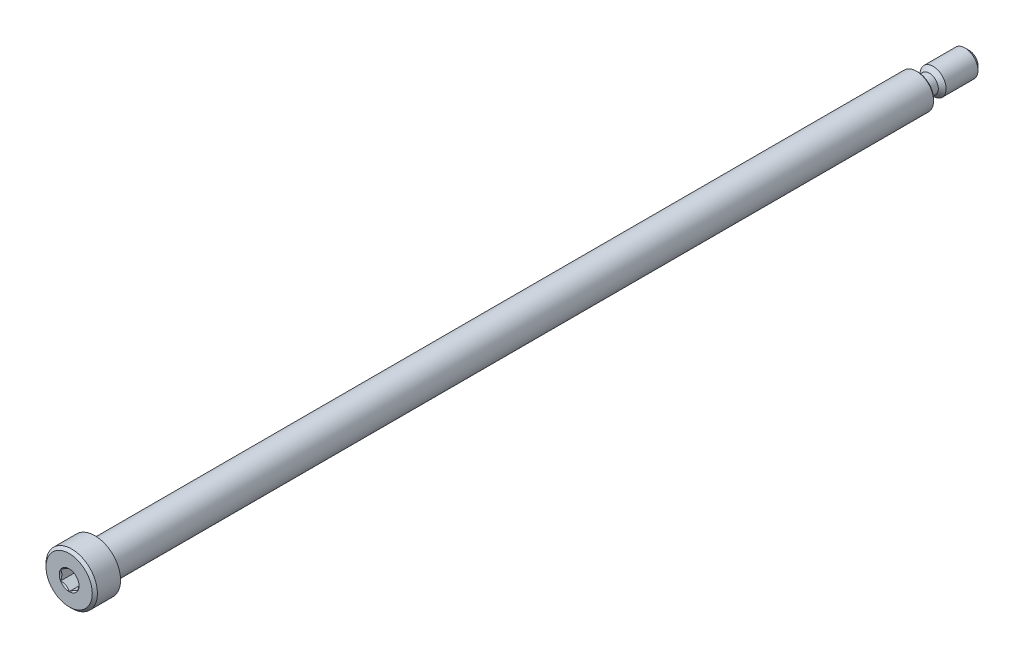
ISO-10303-21;
HEADER;
FILE_DESCRIPTION(('STEP AP214'),'2;1');
FILE_NAME('part.step','',(''),(''),'','','');
FILE_SCHEMA(('AUTOMOTIVE_DESIGN { 1 0 10303 214 1 1 1 1 }'));
ENDSEC;
DATA;
#1=APPLICATION_CONTEXT('core data for automotive mechanical design processes');
#2=APPLICATION_PROTOCOL_DEFINITION('international standard','automotive_design',2000,#1);
#3=PRODUCT_CONTEXT('',#1,'mechanical');
#4=PRODUCT('Part','Part','',(#3));
#5=PRODUCT_RELATED_PRODUCT_CATEGORY('part','',(#4));
#6=PRODUCT_DEFINITION_FORMATION('','',#4);
#7=PRODUCT_DEFINITION_CONTEXT('part definition',#1,'design');
#8=PRODUCT_DEFINITION('design','',#6,#7);
#9=PRODUCT_DEFINITION_SHAPE('','',#8);
#10=(LENGTH_UNIT() NAMED_UNIT(*) SI_UNIT(.MILLI.,.METRE.));
#11=(NAMED_UNIT(*) PLANE_ANGLE_UNIT() SI_UNIT($,.RADIAN.));
#12=(NAMED_UNIT(*) SI_UNIT($,.STERADIAN.) SOLID_ANGLE_UNIT());
#13=UNCERTAINTY_MEASURE_WITH_UNIT(LENGTH_MEASURE(1.E-05),#10,'distance_accuracy_value','');
#14=(GEOMETRIC_REPRESENTATION_CONTEXT(3) GLOBAL_UNCERTAINTY_ASSIGNED_CONTEXT((#13)) GLOBAL_UNIT_ASSIGNED_CONTEXT((#10,
#11,#12)) REPRESENTATION_CONTEXT('',''));
#15=CARTESIAN_POINT('',(0.,0.,0.));
#16=DIRECTION('',(0.,0.,1.));
#17=DIRECTION('',(1.,0.,0.));
#18=AXIS2_PLACEMENT_3D('',#15,#16,#17);
#19=CARTESIAN_POINT('',(0.,4.28625,83.34375));
#20=DIRECTION('',(0.,0.,-1.));
#21=DIRECTION('',(0.,1.,0.));
#22=AXIS2_PLACEMENT_3D('',#19,#20,#21);
#23=PLANE('',#22);
#24=CARTESIAN_POINT('',(0.,0.,83.34375));
#25=DIRECTION('',(0.,0.,1.));
#26=DIRECTION('',(1.,0.,0.));
#27=AXIS2_PLACEMENT_3D('',#24,#25,#26);
#28=CIRCLE('',#27,1.83308710467706);
#29=CARTESIAN_POINT('',(0.,1.83308710467706,83.34375));
#30=VERTEX_POINT('',#29);
#31=CARTESIAN_POINT('',(-1.5875,0.916543552338533,83.34375));
#32=VERTEX_POINT('',#31);
#33=EDGE_CURVE('E139',#30,#32,#28,.T.);
#34=ORIENTED_EDGE('',*,*,#33,.F.);
#35=CARTESIAN_POINT('',(1.5875,0.916543552338532,83.34375));
#36=VERTEX_POINT('',#35);
#37=EDGE_CURVE('E110',#36,#30,#28,.T.);
#38=ORIENTED_EDGE('',*,*,#37,.F.);
#39=CARTESIAN_POINT('',(1.5875,-0.916543552338531,83.34375));
#40=VERTEX_POINT('',#39);
#41=EDGE_CURVE('E99',#40,#36,#28,.T.);
#42=ORIENTED_EDGE('',*,*,#41,.F.);
#43=CARTESIAN_POINT('',(0.,-1.83308710467706,83.34375));
#44=VERTEX_POINT('',#43);
#45=EDGE_CURVE('E60',#44,#40,#28,.T.);
#46=ORIENTED_EDGE('',*,*,#45,.F.);
#47=CARTESIAN_POINT('',(-1.5875,-0.91654355233853,83.34375));
#48=VERTEX_POINT('',#47);
#49=EDGE_CURVE('E67',#48,#44,#28,.T.);
#50=ORIENTED_EDGE('',*,*,#49,.F.);
#51=EDGE_CURVE('E147',#32,#48,#28,.T.);
#52=ORIENTED_EDGE('',*,*,#51,.F.);
#53=EDGE_LOOP('',(#34,#38,#42,#46,#50,#52));
#54=FACE_BOUND('',#53,.T.);
#55=CARTESIAN_POINT('',(0.,0.,83.34375));
#56=DIRECTION('',(0.,0.,1.));
#57=DIRECTION('',(0.,-1.,0.));
#58=AXIS2_PLACEMENT_3D('',#55,#56,#57);
#59=CIRCLE('',#58,4.28625);
#60=CARTESIAN_POINT('',(0.,-4.28625,83.34375));
#61=VERTEX_POINT('',#60);
#62=EDGE_CURVE('E54',#61,#61,#59,.T.);
#63=ORIENTED_EDGE('',*,*,#62,.T.);
#64=EDGE_LOOP('',(#63));
#65=FACE_BOUND('',#64,.T.);
#66=ADVANCED_FACE('F45',(#54,#65),#23,.F.);
#67=CARTESIAN_POINT('',(0.,0.,82.8675));
#68=DIRECTION('',(0.,0.,-1.));
#69=DIRECTION('',(0.,1.,0.));
#70=AXIS2_PLACEMENT_3D('',#67,#68,#69);
#71=CONICAL_SURFACE('',#70,4.7625,0.78539816339745);
#72=ORIENTED_EDGE('',*,*,#62,.F.);
#73=EDGE_LOOP('',(#72));
#74=FACE_BOUND('',#73,.T.);
#75=CARTESIAN_POINT('',(0.,0.,82.8675));
#76=DIRECTION('',(0.,0.,1.));
#77=DIRECTION('',(0.,-1.,0.));
#78=AXIS2_PLACEMENT_3D('',#75,#76,#77);
#79=CIRCLE('',#78,4.7625);
#80=CARTESIAN_POINT('',(0.,-4.7625,82.8675));
#81=VERTEX_POINT('',#80);
#82=EDGE_CURVE('E312',#81,#81,#79,.T.);
#83=ORIENTED_EDGE('',*,*,#82,.T.);
#84=EDGE_LOOP('',(#83));
#85=FACE_BOUND('',#84,.T.);
#86=ADVANCED_FACE('F221',(#74,#85),#71,.T.);
#87=CARTESIAN_POINT('',(0.,0.,83.34375));
#88=DIRECTION('',(0.,0.,1.));
#89=DIRECTION('',(0.,-1.,0.));
#90=AXIS2_PLACEMENT_3D('',#87,#88,#89);
#91=CYLINDRICAL_SURFACE('',#90,4.7625);
#92=ORIENTED_EDGE('',*,*,#82,.F.);
#93=EDGE_LOOP('',(#92));
#94=FACE_BOUND('',#93,.T.);
#95=CARTESIAN_POINT('',(0.,0.,78.58125));
#96=DIRECTION('',(0.,0.,1.));
#97=DIRECTION('',(0.,-1.,0.));
#98=AXIS2_PLACEMENT_3D('',#95,#96,#97);
#99=CIRCLE('',#98,4.7625);
#100=CARTESIAN_POINT('',(0.,-4.7625,78.58125));
#101=VERTEX_POINT('',#100);
#102=EDGE_CURVE('E308',#101,#101,#99,.T.);
#103=ORIENTED_EDGE('',*,*,#102,.T.);
#104=EDGE_LOOP('',(#103));
#105=FACE_BOUND('',#104,.T.);
#106=ADVANCED_FACE('F225',(#94,#105),#91,.T.);
#107=CARTESIAN_POINT('',(0.,4.7625,78.58125));
#108=DIRECTION('',(0.,0.,1.));
#109=DIRECTION('',(0.,-1.,0.));
#110=AXIS2_PLACEMENT_3D('',#107,#108,#109);
#111=PLANE('',#110);
#112=ORIENTED_EDGE('',*,*,#102,.F.);
#113=EDGE_LOOP('',(#112));
#114=FACE_BOUND('',#113,.T.);
#115=CARTESIAN_POINT('',(0.,0.,78.58125));
#116=DIRECTION('',(0.,0.,1.));
#117=DIRECTION('',(0.,-1.,0.));
#118=AXIS2_PLACEMENT_3D('',#115,#116,#117);
#119=CIRCLE('',#118,3.175);
#120=CARTESIAN_POINT('',(0.,-3.175,78.58125));
#121=VERTEX_POINT('',#120);
#122=EDGE_CURVE('E304',#121,#121,#119,.T.);
#123=ORIENTED_EDGE('',*,*,#122,.T.);
#124=EDGE_LOOP('',(#123));
#125=FACE_BOUND('',#124,.T.);
#126=ADVANCED_FACE('F230',(#114,#125),#111,.F.);
#127=CARTESIAN_POINT('',(0.,0.,83.34375));
#128=DIRECTION('',(0.,0.,1.));
#129=DIRECTION('',(0.,-1.,0.));
#130=AXIS2_PLACEMENT_3D('',#127,#128,#129);
#131=CYLINDRICAL_SURFACE('',#130,3.175);
#132=ORIENTED_EDGE('',*,*,#122,.F.);
#133=EDGE_LOOP('',(#132));
#134=FACE_BOUND('',#133,.T.);
#135=CARTESIAN_POINT('',(0.,0.,-73.56475));
#136=DIRECTION('',(0.,0.,1.));
#137=DIRECTION('',(0.,-1.,0.));
#138=AXIS2_PLACEMENT_3D('',#135,#136,#137);
#139=CIRCLE('',#138,3.175);
#140=CARTESIAN_POINT('',(0.,-3.175,-73.56475));
#141=VERTEX_POINT('',#140);
#142=EDGE_CURVE('E300',#141,#141,#139,.T.);
#143=ORIENTED_EDGE('',*,*,#142,.T.);
#144=EDGE_LOOP('',(#143));
#145=FACE_BOUND('',#144,.T.);
#146=ADVANCED_FACE('F238',(#134,#145),#131,.T.);
#147=CARTESIAN_POINT('',(0.,0.,-73.81875));
#148=DIRECTION('',(0.,0.,1.));
#149=DIRECTION('',(0.,-1.,0.));
#150=AXIS2_PLACEMENT_3D('',#147,#148,#149);
#151=CONICAL_SURFACE('',#150,2.921,0.78539816339744);
#152=ORIENTED_EDGE('',*,*,#142,.F.);
#153=EDGE_LOOP('',(#152));
#154=FACE_BOUND('',#153,.T.);
#155=CARTESIAN_POINT('',(0.,0.,-73.81875));
#156=DIRECTION('',(0.,0.,1.));
#157=DIRECTION('',(0.,-1.,0.));
#158=AXIS2_PLACEMENT_3D('',#155,#156,#157);
#159=CIRCLE('',#158,2.921);
#160=CARTESIAN_POINT('',(0.,-2.921,-73.81875));
#161=VERTEX_POINT('',#160);
#162=EDGE_CURVE('E283',#161,#161,#159,.T.);
#163=ORIENTED_EDGE('',*,*,#162,.T.);
#164=EDGE_LOOP('',(#163));
#165=FACE_BOUND('',#164,.T.);
#166=ADVANCED_FACE('F242',(#154,#165),#151,.T.);
#167=CARTESIAN_POINT('',(0.,2.921,-73.81875));
#168=DIRECTION('',(0.,0.,1.));
#169=DIRECTION('',(0.,-1.,0.));
#170=AXIS2_PLACEMENT_3D('',#167,#168,#169);
#171=PLANE('',#170);
#172=CARTESIAN_POINT('',(0.,0.,-73.81875));
#173=DIRECTION('',(0.,0.,-1.));
#174=DIRECTION('',(0.,1.,0.));
#175=AXIS2_PLACEMENT_3D('',#172,#173,#174);
#176=CIRCLE('',#175,2.413);
#177=CARTESIAN_POINT('',(0.,2.413,-73.81875));
#178=VERTEX_POINT('',#177);
#179=EDGE_CURVE('E574',#178,#178,#176,.T.);
#180=ORIENTED_EDGE('',*,*,#179,.F.);
#181=EDGE_LOOP('',(#180));
#182=FACE_BOUND('',#181,.T.);
#183=ORIENTED_EDGE('',*,*,#162,.F.);
#184=EDGE_LOOP('',(#183));
#185=FACE_BOUND('',#184,.T.);
#186=ADVANCED_FACE('F246',(#182,#185),#171,.F.);
#187=CARTESIAN_POINT('',(0.,0.,83.34375));
#188=DIRECTION('',(0.,0.,1.));
#189=DIRECTION('',(1.,0.,0.));
#190=AXIS2_PLACEMENT_3D('',#187,#188,#189);
#191=CONICAL_SURFACE('',#190,1.83308710467706,0.78539816339745);
#192=ORIENTED_EDGE('',*,*,#37,.T.);
#193=CARTESIAN_POINT('',(1.5877,0.916428082284694,83.3438654809637));
#194=CARTESIAN_POINT('',(1.53312479190086,0.94793709337181,83.3123808083706));
#195=CARTESIAN_POINT('',(1.47763696320971,0.979973006203396,83.2827450460135));
#196=CARTESIAN_POINT('',(1.36449087915364,1.04529792829092,83.2284822600208));
#197=CARTESIAN_POINT('',(1.30682185887062,1.07859315267523,83.2038854351332));
#198=CARTESIAN_POINT('',(1.19053497812689,1.14573141457584,83.1617503642726));
#199=CARTESIAN_POINT('',(1.13194674474406,1.17955734689076,83.1441061927298));
#200=CARTESIAN_POINT('',(1.01348022674556,1.24795402294715,83.116921470085));
#201=CARTESIAN_POINT('',(0.953605562983889,1.28252267618759,83.1073606206951));
#202=CARTESIAN_POINT('',(0.850418771876551,1.34209759781022,83.098734413104));
#203=CARTESIAN_POINT('',(0.807240015952281,1.36702686416638,83.0974571928096));
#204=CARTESIAN_POINT('',(0.720953038535392,1.41684467380558,83.0996070558147));
#205=CARTESIAN_POINT('',(0.677844847078605,1.44173319974743,83.1030357885493));
#206=CARTESIAN_POINT('',(0.592046335002023,1.49126899379091,83.1144009944333));
#207=CARTESIAN_POINT('',(0.549356408925397,1.51591603410294,83.1223413718017));
#208=CARTESIAN_POINT('',(0.464693063478349,1.56479643938729,83.1422984144511));
#209=CARTESIAN_POINT('',(0.422719959755067,1.58902962212065,83.1543168292087));
#210=CARTESIAN_POINT('',(0.31521145811356,1.65109968448354,83.1899968972473));
#211=CARTESIAN_POINT('',(0.250342771708892,1.68855163804126,83.2163485723031));
#212=CARTESIAN_POINT('',(0.15496159938092,1.74361998356043,83.2608335368517));
#213=CARTESIAN_POINT('',(0.123530699536155,1.76176662204668,83.2764628578011));
#214=CARTESIAN_POINT('',(0.0612469855696381,1.79772614107138,83.3091484878611));
#215=CARTESIAN_POINT('',(0.0303939039605778,1.8155391760437,83.326204115657));
#216=CARTESIAN_POINT('',(-0.00020000000000132,1.8332025747309,83.3438654809637));
#217=B_SPLINE_CURVE_WITH_KNOTS('',3,(#193,#194,#195,#196,#197,#198,#199,#200,#201,#202,#203,
#204,#205,#206,#207,#208,#209,#210,#211,#212,#213,#214,#215,#216),.UNSPECIFIED.,.F.,.F.,(4,2,2,
2,2,2,2,2,2,2,2,4),(0.,0.211482650810821,0.424197870807283,0.633533884524823,0.842342653263357,
0.99175555372715,1.14122083674205,1.29081565918879,1.44047473906439,1.67818780869721,
1.79671410024894,1.91518409436631),.UNSPECIFIED.);
#218=EDGE_CURVE('E11',#36,#30,#217,.T.);
#219=ORIENTED_EDGE('',*,*,#218,.F.);
#220=EDGE_LOOP('',(#192,#219));
#221=FACE_BOUND('',#220,.T.);
#222=ADVANCED_FACE('F113',(#221),#191,.F.);
#223=ORIENTED_EDGE('',*,*,#33,.T.);
#224=CARTESIAN_POINT('',(0.000200000000000248,1.8332025747309,83.3438654809637));
#225=CARTESIAN_POINT('',(-0.054375208099136,1.80169356364378,83.3123808083706));
#226=CARTESIAN_POINT('',(-0.10986303679029,1.7696576508122,83.2827450460135));
#227=CARTESIAN_POINT('',(-0.223009120846361,1.70433272872467,83.2284822600208));
#228=CARTESIAN_POINT('',(-0.280678141129384,1.67103750434037,83.2038854351332));
#229=CARTESIAN_POINT('',(-0.396965021873107,1.60389924243976,83.1617503642726));
#230=CARTESIAN_POINT('',(-0.455553255255935,1.57007331012484,83.1441061927298));
#231=CARTESIAN_POINT('',(-0.574019773254436,1.50167663406845,83.116921470085));
#232=CARTESIAN_POINT('',(-0.63389443701611,1.467107980828,83.1073606206951));
#233=CARTESIAN_POINT('',(-0.737081228123448,1.40753305920537,83.098734413104));
#234=CARTESIAN_POINT('',(-0.780259984047718,1.38260379284922,83.0974571928096));
#235=CARTESIAN_POINT('',(-0.866546961464608,1.33278598321002,83.0996070558147));
#236=CARTESIAN_POINT('',(-0.909655152921394,1.30789745726817,83.1030357885493));
#237=CARTESIAN_POINT('',(-0.995453664997977,1.25836166322468,83.1144009944333));
#238=CARTESIAN_POINT('',(-1.0381435910746,1.23371462291266,83.1223413718017));
#239=CARTESIAN_POINT('',(-1.12280693652165,1.18483421762831,83.1422984144511));
#240=CARTESIAN_POINT('',(-1.16478004024493,1.16060103489495,83.1543168292087));
#241=CARTESIAN_POINT('',(-1.27228854188644,1.09853097253205,83.1899968972473));
#242=CARTESIAN_POINT('',(-1.33715722829111,1.06107901897434,83.2163485723031));
#243=CARTESIAN_POINT('',(-1.43253840061908,1.00601067345516,83.2608335368517));
#244=CARTESIAN_POINT('',(-1.46396930046384,0.987864034968914,83.2764628578011));
#245=CARTESIAN_POINT('',(-1.52625301443036,0.951904515944216,83.3091484878611));
#246=CARTESIAN_POINT('',(-1.55710609603942,0.934091480971895,83.326204115657));
#247=CARTESIAN_POINT('',(-1.5877,0.916428082284693,83.3438654809637));
#248=B_SPLINE_CURVE_WITH_KNOTS('',3,(#224,#225,#226,#227,#228,#229,#230,#231,#232,#233,#234,
#235,#236,#237,#238,#239,#240,#241,#242,#243,#244,#245,#246,#247),.UNSPECIFIED.,.F.,.F.,(4,2,2,
2,2,2,2,2,2,2,2,4),(0.,0.211482650810822,0.424197870807283,0.633533884524824,0.842342653263356,
0.991755553727151,1.14122083674206,1.29081565918879,1.44047473906439,1.67818780869721,
1.79671410024895,1.91518409436632),.UNSPECIFIED.);
#249=EDGE_CURVE('E141',#30,#32,#248,.T.);
#250=ORIENTED_EDGE('',*,*,#249,.F.);
#251=EDGE_LOOP('',(#223,#250));
#252=FACE_BOUND('',#251,.T.);
#253=ADVANCED_FACE('F346',(#252),#191,.F.);
#254=ORIENTED_EDGE('',*,*,#51,.T.);
#255=CARTESIAN_POINT('',(-1.5875,-1.82796193752853,83.9317372632541));
#256=CARTESIAN_POINT('',(-1.5875,-1.78345227640907,83.8981366526755));
#257=CARTESIAN_POINT('',(-1.5875,-1.73869460884113,83.8648654952982));
#258=CARTESIAN_POINT('',(-1.5875,-1.64858256619968,83.7991181178338));
#259=CARTESIAN_POINT('',(-1.5875,-1.60322804415397,83.7666420993982));
#260=CARTESIAN_POINT('',(-1.5875,-1.46545441997287,83.6701476121245));
#261=CARTESIAN_POINT('',(-1.5875,-1.37200191361453,83.6075801635837));
#262=CARTESIAN_POINT('',(-1.5875,-1.17603565005265,83.484752804527));
#263=CARTESIAN_POINT('',(-1.5875,-1.07330915482379,83.424828449735));
#264=CARTESIAN_POINT('',(-1.5875,-0.862725191180882,83.3152140327188));
#265=CARTESIAN_POINT('',(-1.5875,-0.754886591703728,83.2654894689971));
#266=CARTESIAN_POINT('',(-1.5875,-0.593019911876896,83.2046560741112));
#267=CARTESIAN_POINT('',(-1.5875,-0.541388282021828,83.1871964520654));
#268=CARTESIAN_POINT('',(-1.5875,-0.436878539726303,83.1564223678696));
#269=CARTESIAN_POINT('',(-1.5875,-0.384000341684461,83.1431081912829));
#270=CARTESIAN_POINT('',(-1.5875,-0.278196924280273,83.1215383054897));
#271=CARTESIAN_POINT('',(-1.5875,-0.225289653887527,83.1131959280048));
#272=CARTESIAN_POINT('',(-1.5875,-0.11890929956433,83.1017325177097));
#273=CARTESIAN_POINT('',(-1.5875,-0.0654363144870813,83.0986105873603));
#274=CARTESIAN_POINT('',(-1.5875,0.0396125416393659,83.0978196410889));
#275=CARTESIAN_POINT('',(-1.5875,0.0911870234776919,83.0999573430076));
#276=CARTESIAN_POINT('',(-1.5875,0.193894008986136,83.1091413684641));
#277=CARTESIAN_POINT('',(-1.5875,0.245026469231599,83.1161881688511));
#278=CARTESIAN_POINT('',(-1.5875,0.347344844708746,83.1349252166609));
#279=CARTESIAN_POINT('',(-1.5875,0.398516068757364,83.1466944835388));
#280=CARTESIAN_POINT('',(-1.5875,0.499740445944843,83.174250946481));
#281=CARTESIAN_POINT('',(-1.5875,0.549793692255948,83.1900378063498));
#282=CARTESIAN_POINT('',(-1.5875,0.707380773963353,83.2456797782163));
#283=CARTESIAN_POINT('',(-1.5875,0.812671633972069,83.2918718624579));
#284=CARTESIAN_POINT('',(-1.5875,1.01830702525798,83.3945743357708));
#285=CARTESIAN_POINT('',(-1.5875,1.11863208590429,83.4511217953495));
#286=CARTESIAN_POINT('',(-1.5875,1.31036772781772,83.5677841931104));
#287=CARTESIAN_POINT('',(-1.5875,1.40197355431624,83.6275822157844));
#288=CARTESIAN_POINT('',(-1.5875,1.53693633902,83.7200238021751));
#289=CARTESIAN_POINT('',(-1.5875,1.58134147295665,83.751163627594));
#290=CARTESIAN_POINT('',(-1.5875,1.66954488801523,83.8142668194013));
#291=CARTESIAN_POINT('',(-1.5875,1.71334333266279,83.8462299569622));
#292=CARTESIAN_POINT('',(-1.5875,1.75688919183915,83.8785344886323));
#293=B_SPLINE_CURVE_WITH_KNOTS('',3,(#255,#256,#257,#258,#259,#260,#261,#262,#263,#264,#265,
#266,#267,#268,#269,#270,#271,#272,#273,#274,#275,#276,#277,#278,#279,#280,#281,#282,#283,#284,
#285,#286,#287,#288,#289,#290,#291,#292),.UNSPECIFIED.,.F.,.F.,(4,2,2,2,2,2,2,2,2,2,2,2,2,2,2,2,
2,2,4),(0.,0.167300856038496,0.334643709948949,0.671883358487446,1.02837224639231,
1.38363464368217,1.54700775551668,1.71039211899208,1.8708380735955,2.03125644026827,
2.18586834465335,2.3404952694859,2.49782525419328,2.65514207772672,2.99906299923215,
3.34424006214765,3.67226428551494,3.83496498281156,3.99762093763057),.UNSPECIFIED.);
#294=EDGE_CURVE('E145',#32,#48,#293,.F.);
#295=ORIENTED_EDGE('',*,*,#294,.F.);
#296=EDGE_LOOP('',(#254,#295));
#297=FACE_BOUND('',#296,.T.);
#298=ADVANCED_FACE('F337',(#297),#191,.F.);
#299=ORIENTED_EDGE('',*,*,#49,.T.);
#300=CARTESIAN_POINT('',(-1.5877,-0.916428082284693,83.3438654809637));
#301=CARTESIAN_POINT('',(-1.53312479190086,-0.947937093371809,83.3123808083706));
#302=CARTESIAN_POINT('',(-1.47763696320971,-0.979973006203394,83.2827450460135));
#303=CARTESIAN_POINT('',(-1.36449087915364,-1.04529792829092,83.2284822600208));
#304=CARTESIAN_POINT('',(-1.30682185887062,-1.07859315267522,83.2038854351332));
#305=CARTESIAN_POINT('',(-1.19053497812689,-1.14573141457583,83.1617503642726));
#306=CARTESIAN_POINT('',(-1.13194674474407,-1.17955734689075,83.1441061927298));
#307=CARTESIAN_POINT('',(-1.01348022674557,-1.24795402294715,83.116921470085));
#308=CARTESIAN_POINT('',(-0.953605562983891,-1.28252267618759,83.1073606206951));
#309=CARTESIAN_POINT('',(-0.850418771876552,-1.34209759781022,83.098734413104));
#310=CARTESIAN_POINT('',(-0.807240015952282,-1.36702686416637,83.0974571928096));
#311=CARTESIAN_POINT('',(-0.720953038535392,-1.41684467380557,83.0996070558147));
#312=CARTESIAN_POINT('',(-0.677844847078605,-1.44173319974743,83.1030357885493));
#313=CARTESIAN_POINT('',(-0.592046335002023,-1.49126899379091,83.1144009944333));
#314=CARTESIAN_POINT('',(-0.549356408925397,-1.51591603410294,83.1223413718017));
#315=CARTESIAN_POINT('',(-0.46469306347835,-1.56479643938728,83.1422984144511));
#316=CARTESIAN_POINT('',(-0.422719959755068,-1.58902962212065,83.1543168292087));
#317=CARTESIAN_POINT('',(-0.315211458113561,-1.65109968448354,83.1899968972473));
#318=CARTESIAN_POINT('',(-0.250342771708892,-1.68855163804126,83.2163485723031));
#319=CARTESIAN_POINT('',(-0.15496159938092,-1.74361998356043,83.2608335368517));
#320=CARTESIAN_POINT('',(-0.123530699536155,-1.76176662204668,83.2764628578011));
#321=CARTESIAN_POINT('',(-0.0612469855696383,-1.79772614107138,83.3091484878611));
#322=CARTESIAN_POINT('',(-0.030393903960578,-1.8155391760437,83.326204115657));
#323=CARTESIAN_POINT('',(0.000200000000001059,-1.8332025747309,83.3438654809637));
#324=B_SPLINE_CURVE_WITH_KNOTS('',3,(#300,#301,#302,#303,#304,#305,#306,#307,#308,#309,#310,
#311,#312,#313,#314,#315,#316,#317,#318,#319,#320,#321,#322,#323),.UNSPECIFIED.,.F.,.F.,(4,2,2,
2,2,2,2,2,2,2,2,4),(0.,0.211482650810822,0.424197870807283,0.633533884524821,0.842342653263357,
0.991755553727151,1.14122083674206,1.29081565918879,1.44047473906439,1.67818780869721,
1.79671410024895,1.91518409436632),.UNSPECIFIED.);
#325=EDGE_CURVE('E185',#48,#44,#324,.T.);
#326=ORIENTED_EDGE('',*,*,#325,.F.);
#327=EDGE_LOOP('',(#299,#326));
#328=FACE_BOUND('',#327,.T.);
#329=ADVANCED_FACE('F338',(#328),#191,.F.);
#330=ORIENTED_EDGE('',*,*,#45,.T.);
#331=CARTESIAN_POINT('',(-0.000200000000001125,-1.8332025747309,83.3438654809637));
#332=CARTESIAN_POINT('',(0.054375208099135,-1.80169356364378,83.3123808083706));
#333=CARTESIAN_POINT('',(0.109863036790289,-1.7696576508122,83.2827450460135));
#334=CARTESIAN_POINT('',(0.22300912084636,-1.70433272872467,83.2284822600208));
#335=CARTESIAN_POINT('',(0.280678141129382,-1.67103750434037,83.2038854351332));
#336=CARTESIAN_POINT('',(0.396965021873106,-1.60389924243976,83.1617503642726));
#337=CARTESIAN_POINT('',(0.455553255255935,-1.57007331012484,83.1441061927298));
#338=CARTESIAN_POINT('',(0.574019773254435,-1.50167663406845,83.116921470085));
#339=CARTESIAN_POINT('',(0.633894437016109,-1.467107980828,83.1073606206951));
#340=CARTESIAN_POINT('',(0.737081228123448,-1.40753305920537,83.098734413104));
#341=CARTESIAN_POINT('',(0.780259984047718,-1.38260379284922,83.0974571928096));
#342=CARTESIAN_POINT('',(0.866546961464607,-1.33278598321002,83.0996070558147));
#343=CARTESIAN_POINT('',(0.909655152921394,-1.30789745726816,83.1030357885493));
#344=CARTESIAN_POINT('',(0.995453664997976,-1.25836166322468,83.1144009944333));
#345=CARTESIAN_POINT('',(1.0381435910746,-1.23371462291266,83.1223413718017));
#346=CARTESIAN_POINT('',(1.12280693652165,-1.18483421762831,83.1422984144511));
#347=CARTESIAN_POINT('',(1.16478004024493,-1.16060103489495,83.1543168292087));
#348=CARTESIAN_POINT('',(1.27228854188644,-1.09853097253205,83.1899968972473));
#349=CARTESIAN_POINT('',(1.33715722829111,-1.06107901897434,83.2163485723031));
#350=CARTESIAN_POINT('',(1.43253840061908,-1.00601067345516,83.2608335368517));
#351=CARTESIAN_POINT('',(1.46396930046384,-0.987864034968913,83.2764628578011));
#352=CARTESIAN_POINT('',(1.52625301443036,-0.951904515944215,83.3091484878611));
#353=CARTESIAN_POINT('',(1.55710609603942,-0.934091480971894,83.326204115657));
#354=CARTESIAN_POINT('',(1.5877,-0.916428082284692,83.3438654809637));
#355=B_SPLINE_CURVE_WITH_KNOTS('',3,(#331,#332,#333,#334,#335,#336,#337,#338,#339,#340,#341,
#342,#343,#344,#345,#346,#347,#348,#349,#350,#351,#352,#353,#354),.UNSPECIFIED.,.F.,.F.,(4,2,2,
2,2,2,2,2,2,2,2,4),(0.,0.211482650810821,0.424197870807283,0.633533884524824,0.842342653263357,
0.991755553727151,1.14122083674206,1.29081565918879,1.44047473906439,1.67818780869721,
1.79671410024895,1.91518409436632),.UNSPECIFIED.);
#356=EDGE_CURVE('E126',#44,#40,#355,.T.);
#357=ORIENTED_EDGE('',*,*,#356,.F.);
#358=EDGE_LOOP('',(#330,#357));
#359=FACE_BOUND('',#358,.T.);
#360=ADVANCED_FACE('F171',(#359),#191,.F.);
#361=ORIENTED_EDGE('',*,*,#41,.T.);
#362=CARTESIAN_POINT('',(1.5875,-1.82796193752853,83.9317372632541));
#363=CARTESIAN_POINT('',(1.5875,-1.78345227640907,83.8981366526755));
#364=CARTESIAN_POINT('',(1.5875,-1.73869460884113,83.8648654952982));
#365=CARTESIAN_POINT('',(1.5875,-1.64858256619968,83.7991181178338));
#366=CARTESIAN_POINT('',(1.5875,-1.60322804415397,83.7666420993982));
#367=CARTESIAN_POINT('',(1.5875,-1.46545441997287,83.6701476121245));
#368=CARTESIAN_POINT('',(1.5875,-1.37200191361453,83.6075801635837));
#369=CARTESIAN_POINT('',(1.5875,-1.17603565005265,83.484752804527));
#370=CARTESIAN_POINT('',(1.5875,-1.0733091548238,83.424828449735));
#371=CARTESIAN_POINT('',(1.5875,-0.862725191180893,83.3152140327188));
#372=CARTESIAN_POINT('',(1.5875,-0.754886591703735,83.2654894689971));
#373=CARTESIAN_POINT('',(1.5875,-0.593019911876898,83.2046560741112));
#374=CARTESIAN_POINT('',(1.5875,-0.54138828202183,83.1871964520654));
#375=CARTESIAN_POINT('',(1.5875,-0.436878539726306,83.1564223678696));
#376=CARTESIAN_POINT('',(1.5875,-0.384000341684465,83.1431081912829));
#377=CARTESIAN_POINT('',(1.5875,-0.278196924280277,83.1215383054897));
#378=CARTESIAN_POINT('',(1.5875,-0.22528965388753,83.1131959280048));
#379=CARTESIAN_POINT('',(1.5875,-0.118909299564332,83.1017325177097));
#380=CARTESIAN_POINT('',(1.5875,-0.0654363144870825,83.0986105873603));
#381=CARTESIAN_POINT('',(1.5875,0.0396125416393647,83.0978196410889));
#382=CARTESIAN_POINT('',(1.5875,0.09118702347769,83.0999573430076));
#383=CARTESIAN_POINT('',(1.5875,0.193894008986135,83.1091413684641));
#384=CARTESIAN_POINT('',(1.5875,0.245026469231599,83.1161881688511));
#385=CARTESIAN_POINT('',(1.5875,0.347344844708747,83.1349252166609));
#386=CARTESIAN_POINT('',(1.5875,0.398516068757365,83.1466944835388));
#387=CARTESIAN_POINT('',(1.5875,0.499740445944845,83.174250946481));
#388=CARTESIAN_POINT('',(1.5875,0.549793692255949,83.1900378063498));
#389=CARTESIAN_POINT('',(1.5875,0.707380773963357,83.2456797782163));
#390=CARTESIAN_POINT('',(1.5875,0.812671633972072,83.291871862458));
#391=CARTESIAN_POINT('',(1.5875,1.01830702525799,83.3945743357708));
#392=CARTESIAN_POINT('',(1.5875,1.1186320859043,83.4511217953495));
#393=CARTESIAN_POINT('',(1.5875,1.31036772781773,83.5677841931104));
#394=CARTESIAN_POINT('',(1.5875,1.40197355431624,83.6275822157844));
#395=CARTESIAN_POINT('',(1.5875,1.53693633902,83.7200238021751));
#396=CARTESIAN_POINT('',(1.5875,1.58134147295665,83.751163627594));
#397=CARTESIAN_POINT('',(1.5875,1.66954488801523,83.8142668194013));
#398=CARTESIAN_POINT('',(1.5875,1.71334333266279,83.8462299569622));
#399=CARTESIAN_POINT('',(1.5875,1.75688919183915,83.8785344886323));
#400=B_SPLINE_CURVE_WITH_KNOTS('',3,(#362,#363,#364,#365,#366,#367,#368,#369,#370,#371,#372,
#373,#374,#375,#376,#377,#378,#379,#380,#381,#382,#383,#384,#385,#386,#387,#388,#389,#390,#391,
#392,#393,#394,#395,#396,#397,#398,#399),.UNSPECIFIED.,.F.,.F.,(4,2,2,2,2,2,2,2,2,2,2,2,2,2,2,2,
2,2,4),(0.,0.167300856038496,0.334643709948949,0.671883358487447,1.02837224639229,
1.38363464368217,1.54700775551668,1.71039211899208,1.8708380735955,2.03125644026827,
2.18586834465335,2.3404952694859,2.49782525419328,2.65514207772672,2.99906299923216,
3.34424006214766,3.67226428551494,3.83496498281156,3.99762093763057),.UNSPECIFIED.);
#401=EDGE_CURVE('E103',#40,#36,#400,.T.);
#402=ORIENTED_EDGE('',*,*,#401,.F.);
#403=EDGE_LOOP('',(#361,#402));
#404=FACE_BOUND('',#403,.T.);
#405=ADVANCED_FACE('F101',(#404),#191,.F.);
#406=CARTESIAN_POINT('',(0.,0.,79.771875));
#407=DIRECTION('',(0.,0.,1.));
#408=DIRECTION('',(1.,0.,0.));
#409=AXIS2_PLACEMENT_3D('',#406,#407,#408);
#410=PLANE('',#409);
#411=DIRECTION('',(0.,1.,0.));
#412=VECTOR('',#411,1.);
#413=CARTESIAN_POINT('',(1.5875,-0.916543552338531,79.771875));
#414=LINE('',#413,#412);
#415=CARTESIAN_POINT('',(1.5875,-0.916543552338531,79.771875));
#416=VERTEX_POINT('',#415);
#417=CARTESIAN_POINT('',(1.5875,0.916543552338532,79.771875));
#418=VERTEX_POINT('',#417);
#419=EDGE_CURVE('E125',#416,#418,#414,.T.);
#420=ORIENTED_EDGE('',*,*,#419,.T.);
#421=DIRECTION('',(-0.866025403784439,0.5,0.));
#422=VECTOR('',#421,1.);
#423=CARTESIAN_POINT('',(1.5875,0.916543552338532,79.771875));
#424=LINE('',#423,#422);
#425=CARTESIAN_POINT('',(0.,1.83308710467706,79.771875));
#426=VERTEX_POINT('',#425);
#427=EDGE_CURVE('E130',#418,#426,#424,.T.);
#428=ORIENTED_EDGE('',*,*,#427,.T.);
#429=DIRECTION('',(-0.866025403784439,-0.5,0.));
#430=VECTOR('',#429,1.);
#431=CARTESIAN_POINT('',(0.,1.83308710467706,79.771875));
#432=LINE('',#431,#430);
#433=CARTESIAN_POINT('',(-1.5875,0.916543552338532,79.771875));
#434=VERTEX_POINT('',#433);
#435=EDGE_CURVE('E267',#426,#434,#432,.T.);
#436=ORIENTED_EDGE('',*,*,#435,.T.);
#437=DIRECTION('',(0.,-1.,0.));
#438=VECTOR('',#437,1.);
#439=CARTESIAN_POINT('',(-1.5875,0.916543552338532,79.771875));
#440=LINE('',#439,#438);
#441=CARTESIAN_POINT('',(-1.5875,-0.916543552338531,79.771875));
#442=VERTEX_POINT('',#441);
#443=EDGE_CURVE('E272',#434,#442,#440,.T.);
#444=ORIENTED_EDGE('',*,*,#443,.T.);
#445=DIRECTION('',(0.866025403784439,-0.5,0.));
#446=VECTOR('',#445,1.);
#447=CARTESIAN_POINT('',(-1.5875,-0.916543552338531,79.771875));
#448=LINE('',#447,#446);
#449=CARTESIAN_POINT('',(0.,-1.83308710467706,79.771875));
#450=VERTEX_POINT('',#449);
#451=EDGE_CURVE('E276',#442,#450,#448,.T.);
#452=ORIENTED_EDGE('',*,*,#451,.T.);
#453=DIRECTION('',(0.866025403784439,0.5,0.));
#454=VECTOR('',#453,1.);
#455=CARTESIAN_POINT('',(0.,-1.83308710467706,79.771875));
#456=LINE('',#455,#454);
#457=EDGE_CURVE('E134',#450,#416,#456,.T.);
#458=ORIENTED_EDGE('',*,*,#457,.T.);
#459=EDGE_LOOP('',(#420,#428,#436,#444,#452,#458));
#460=FACE_BOUND('',#459,.T.);
#461=ADVANCED_FACE('F170',(#460),#410,.T.);
#462=CARTESIAN_POINT('',(1.5875,0.916543552338532,79.771875));
#463=DIRECTION('',(0.5,0.866025403784439,0.));
#464=DIRECTION('',(-0.866025403784439,0.5,0.));
#465=AXIS2_PLACEMENT_3D('',#462,#463,#464);
#466=PLANE('',#465);
#467=DIRECTION('',(0.,0.,1.));
#468=VECTOR('',#467,1.);
#469=CARTESIAN_POINT('',(1.5875,0.916543552338532,79.771875));
#470=LINE('',#469,#468);
#471=EDGE_CURVE('E121',#418,#36,#470,.T.);
#472=ORIENTED_EDGE('',*,*,#471,.T.);
#473=ORIENTED_EDGE('',*,*,#218,.T.);
#474=DIRECTION('',(0.,0.,1.));
#475=VECTOR('',#474,1.);
#476=CARTESIAN_POINT('',(0.,1.83308710467706,79.771875));
#477=LINE('',#476,#475);
#478=EDGE_CURVE('E133',#426,#30,#477,.T.);
#479=ORIENTED_EDGE('',*,*,#478,.F.);
#480=ORIENTED_EDGE('',*,*,#427,.F.);
#481=EDGE_LOOP('',(#472,#473,#479,#480));
#482=FACE_BOUND('',#481,.T.);
#483=ADVANCED_FACE('F128',(#482),#466,.F.);
#484=CARTESIAN_POINT('',(0.,1.83308710467706,79.771875));
#485=DIRECTION('',(-0.5,0.866025403784439,0.));
#486=DIRECTION('',(-0.866025403784439,-0.5,0.));
#487=AXIS2_PLACEMENT_3D('',#484,#485,#486);
#488=PLANE('',#487);
#489=ORIENTED_EDGE('',*,*,#478,.T.);
#490=ORIENTED_EDGE('',*,*,#249,.T.);
#491=DIRECTION('',(0.,0.,1.));
#492=VECTOR('',#491,1.);
#493=CARTESIAN_POINT('',(-1.5875,0.916543552338532,79.771875));
#494=LINE('',#493,#492);
#495=EDGE_CURVE('E292',#434,#32,#494,.T.);
#496=ORIENTED_EDGE('',*,*,#495,.F.);
#497=ORIENTED_EDGE('',*,*,#435,.F.);
#498=EDGE_LOOP('',(#489,#490,#496,#497));
#499=FACE_BOUND('',#498,.T.);
#500=ADVANCED_FACE('F163',(#499),#488,.F.);
#501=CARTESIAN_POINT('',(-1.5875,0.916543552338532,79.771875));
#502=DIRECTION('',(-1.,0.,0.));
#503=DIRECTION('',(0.,-1.,0.));
#504=AXIS2_PLACEMENT_3D('',#501,#502,#503);
#505=PLANE('',#504);
#506=ORIENTED_EDGE('',*,*,#495,.T.);
#507=ORIENTED_EDGE('',*,*,#294,.T.);
#508=DIRECTION('',(0.,0.,1.));
#509=VECTOR('',#508,1.);
#510=CARTESIAN_POINT('',(-1.5875,-0.916543552338531,79.771875));
#511=LINE('',#510,#509);
#512=EDGE_CURVE('E288',#442,#48,#511,.T.);
#513=ORIENTED_EDGE('',*,*,#512,.F.);
#514=ORIENTED_EDGE('',*,*,#443,.F.);
#515=EDGE_LOOP('',(#506,#507,#513,#514));
#516=FACE_BOUND('',#515,.T.);
#517=ADVANCED_FACE('F210',(#516),#505,.F.);
#518=CARTESIAN_POINT('',(-1.5875,-0.916543552338531,79.771875));
#519=DIRECTION('',(-0.5,-0.866025403784439,0.));
#520=DIRECTION('',(0.866025403784439,-0.5,0.));
#521=AXIS2_PLACEMENT_3D('',#518,#519,#520);
#522=PLANE('',#521);
#523=ORIENTED_EDGE('',*,*,#512,.T.);
#524=ORIENTED_EDGE('',*,*,#325,.T.);
#525=DIRECTION('',(0.,0.,1.));
#526=VECTOR('',#525,1.);
#527=CARTESIAN_POINT('',(0.,-1.83308710467706,79.771875));
#528=LINE('',#527,#526);
#529=EDGE_CURVE('E284',#450,#44,#528,.T.);
#530=ORIENTED_EDGE('',*,*,#529,.F.);
#531=ORIENTED_EDGE('',*,*,#451,.F.);
#532=EDGE_LOOP('',(#523,#524,#530,#531));
#533=FACE_BOUND('',#532,.T.);
#534=ADVANCED_FACE('F206',(#533),#522,.F.);
#535=CARTESIAN_POINT('',(0.,-1.83308710467706,79.771875));
#536=DIRECTION('',(0.5,-0.866025403784439,0.));
#537=DIRECTION('',(0.866025403784439,0.5,0.));
#538=AXIS2_PLACEMENT_3D('',#535,#536,#537);
#539=PLANE('',#538);
#540=ORIENTED_EDGE('',*,*,#529,.T.);
#541=ORIENTED_EDGE('',*,*,#356,.T.);
#542=DIRECTION('',(0.,0.,1.));
#543=VECTOR('',#542,1.);
#544=CARTESIAN_POINT('',(1.5875,-0.916543552338531,79.771875));
#545=LINE('',#544,#543);
#546=EDGE_CURVE('E123',#416,#40,#545,.T.);
#547=ORIENTED_EDGE('',*,*,#546,.F.);
#548=ORIENTED_EDGE('',*,*,#457,.F.);
#549=EDGE_LOOP('',(#540,#541,#547,#548));
#550=FACE_BOUND('',#549,.T.);
#551=ADVANCED_FACE('F203',(#550),#539,.F.);
#552=CARTESIAN_POINT('',(1.5875,-0.916543552338531,79.771875));
#553=DIRECTION('',(1.,0.,0.));
#554=DIRECTION('',(0.,1.,0.));
#555=AXIS2_PLACEMENT_3D('',#552,#553,#554);
#556=PLANE('',#555);
#557=ORIENTED_EDGE('',*,*,#546,.T.);
#558=ORIENTED_EDGE('',*,*,#401,.T.);
#559=ORIENTED_EDGE('',*,*,#471,.F.);
#560=ORIENTED_EDGE('',*,*,#419,.F.);
#561=EDGE_LOOP('',(#557,#558,#559,#560));
#562=FACE_BOUND('',#561,.T.);
#563=ADVANCED_FACE('F119',(#562),#556,.F.);
#564=CARTESIAN_POINT('',(0.,0.,-74.54265));
#565=DIRECTION('',(0.,0.,-1.));
#566=DIRECTION('',(0.,1.,0.));
#567=AXIS2_PLACEMENT_3D('',#564,#565,#566);
#568=TOROIDAL_SURFACE('',#567,2.413,0.7239);
#569=CARTESIAN_POINT('',(0.,0.,-74.54265));
#570=DIRECTION('',(0.,0.,-1.));
#571=DIRECTION('',(0.,1.,0.));
#572=AXIS2_PLACEMENT_3D('',#569,#570,#571);
#573=CIRCLE('',#572,1.6891);
#574=CARTESIAN_POINT('',(0.,1.6891,-74.54265));
#575=VERTEX_POINT('',#574);
#576=EDGE_CURVE('E573',#575,#575,#573,.T.);
#577=ORIENTED_EDGE('',*,*,#576,.F.);
#578=EDGE_LOOP('',(#577));
#579=FACE_BOUND('',#578,.T.);
#580=ORIENTED_EDGE('',*,*,#179,.T.);
#581=EDGE_LOOP('',(#580));
#582=FACE_BOUND('',#581,.T.);
#583=ADVANCED_FACE('F252',(#579,#582),#568,.F.);
#584=CARTESIAN_POINT('',(0.,0.,-83.34375));
#585=DIRECTION('',(0.,0.,-1.));
#586=DIRECTION('',(0.,1.,0.));
#587=AXIS2_PLACEMENT_3D('',#584,#585,#586);
#588=CYLINDRICAL_SURFACE('',#587,1.6891);
#589=CARTESIAN_POINT('',(0.,0.,-75.92695));
#590=DIRECTION('',(0.,0.,-1.));
#591=DIRECTION('',(0.,1.,0.));
#592=AXIS2_PLACEMENT_3D('',#589,#590,#591);
#593=CIRCLE('',#592,1.6891);
#594=CARTESIAN_POINT('',(0.,1.6891,-75.92695));
#595=VERTEX_POINT('',#594);
#596=EDGE_CURVE('E571',#595,#595,#593,.T.);
#597=ORIENTED_EDGE('',*,*,#596,.F.);
#598=EDGE_LOOP('',(#597));
#599=FACE_BOUND('',#598,.T.);
#600=ORIENTED_EDGE('',*,*,#576,.T.);
#601=EDGE_LOOP('',(#600));
#602=FACE_BOUND('',#601,.T.);
#603=ADVANCED_FACE('F480',(#599,#602),#588,.T.);
#604=CARTESIAN_POINT('',(0.,0.,-75.92695));
#605=DIRECTION('',(0.,0.,-1.));
#606=DIRECTION('',(0.,1.,0.));
#607=AXIS2_PLACEMENT_3D('',#604,#605,#606);
#608=CONICAL_SURFACE('',#607,1.6891,0.785398163397445);
#609=CARTESIAN_POINT('',(0.,0.,-76.65085));
#610=DIRECTION('',(0.,0.,-1.));
#611=DIRECTION('',(0.,1.,0.));
#612=AXIS2_PLACEMENT_3D('',#609,#610,#611);
#613=CIRCLE('',#612,2.413);
#614=CARTESIAN_POINT('',(0.,2.413,-76.65085));
#615=VERTEX_POINT('',#614);
#616=EDGE_CURVE('E48',#615,#615,#613,.F.);
#617=ORIENTED_EDGE('',*,*,#616,.T.);
#618=EDGE_LOOP('',(#617));
#619=FACE_BOUND('',#618,.T.);
#620=ORIENTED_EDGE('',*,*,#596,.T.);
#621=EDGE_LOOP('',(#620));
#622=FACE_BOUND('',#621,.T.);
#623=ADVANCED_FACE('F469',(#619,#622),#608,.T.);
#624=CARTESIAN_POINT('',(0.,1.61924999999365,-83.34375));
#625=DIRECTION('',(0.,0.,-1.));
#626=DIRECTION('',(0.,1.,0.));
#627=AXIS2_PLACEMENT_3D('',#624,#625,#626);
#628=PLANE('',#627);
#629=CARTESIAN_POINT('',(0.,0.,-83.34375));
#630=DIRECTION('',(0.,0.,-1.));
#631=DIRECTION('',(0.,1.,0.));
#632=AXIS2_PLACEMENT_3D('',#629,#630,#631);
#633=CIRCLE('',#632,1.61924999999365);
#634=CARTESIAN_POINT('',(0.,1.61924999999365,-83.34375));
#635=VERTEX_POINT('',#634);
#636=EDGE_CURVE('E582',#635,#635,#633,.T.);
#637=ORIENTED_EDGE('',*,*,#636,.T.);
#638=EDGE_LOOP('',(#637));
#639=FACE_BOUND('',#638,.T.);
#640=ADVANCED_FACE('F459',(#639),#628,.T.);
#641=CARTESIAN_POINT('',(0.,0.,-83.34375));
#642=DIRECTION('',(0.,0.,1.));
#643=DIRECTION('',(0.,-1.,0.));
#644=AXIS2_PLACEMENT_3D('',#641,#642,#643);
#645=CONICAL_SURFACE('',#644,1.61924999999365,0.78539816339745);
#646=CARTESIAN_POINT('',(0.,0.,-82.5499999999937));
#647=DIRECTION('',(0.,0.,-1.));
#648=DIRECTION('',(0.,1.,0.));
#649=AXIS2_PLACEMENT_3D('',#646,#647,#648);
#650=CIRCLE('',#649,2.413);
#651=CARTESIAN_POINT('',(0.,2.413,-82.5499999999937));
#652=VERTEX_POINT('',#651);
#653=EDGE_CURVE('E108',#652,#652,#650,.T.);
#654=ORIENTED_EDGE('',*,*,#653,.T.);
#655=EDGE_LOOP('',(#654));
#656=FACE_BOUND('',#655,.T.);
#657=ORIENTED_EDGE('',*,*,#636,.F.);
#658=EDGE_LOOP('',(#657));
#659=FACE_BOUND('',#658,.T.);
#660=ADVANCED_FACE('F449',(#656,#659),#645,.T.);
#661=CARTESIAN_POINT('',(0.,0.,-83.34375));
#662=DIRECTION('',(0.,0.,-1.));
#663=DIRECTION('',(0.,1.,0.));
#664=AXIS2_PLACEMENT_3D('',#661,#662,#663);
#665=CYLINDRICAL_SURFACE('',#664,2.413);
#666=ORIENTED_EDGE('',*,*,#616,.F.);
#667=EDGE_LOOP('',(#666));
#668=FACE_BOUND('',#667,.T.);
#669=ORIENTED_EDGE('',*,*,#653,.F.);
#670=EDGE_LOOP('',(#669));
#671=FACE_BOUND('',#670,.T.);
#672=ADVANCED_FACE('F172',(#668,#671),#665,.T.);
#673=CLOSED_SHELL('',(#66,#86,#106,#126,#146,#166,#186,#222,#253,#298,#329,#360,#405,#461,#483,
#500,#517,#534,#551,#563,#583,#603,#623,#640,#660,#672));
#674=MANIFOLD_SOLID_BREP('B2',#673);
#675=ADVANCED_BREP_SHAPE_REPRESENTATION('',(#18,#674),#14);
#676=SHAPE_DEFINITION_REPRESENTATION(#9,#675);
ENDSEC;
END-ISO-10303-21;
